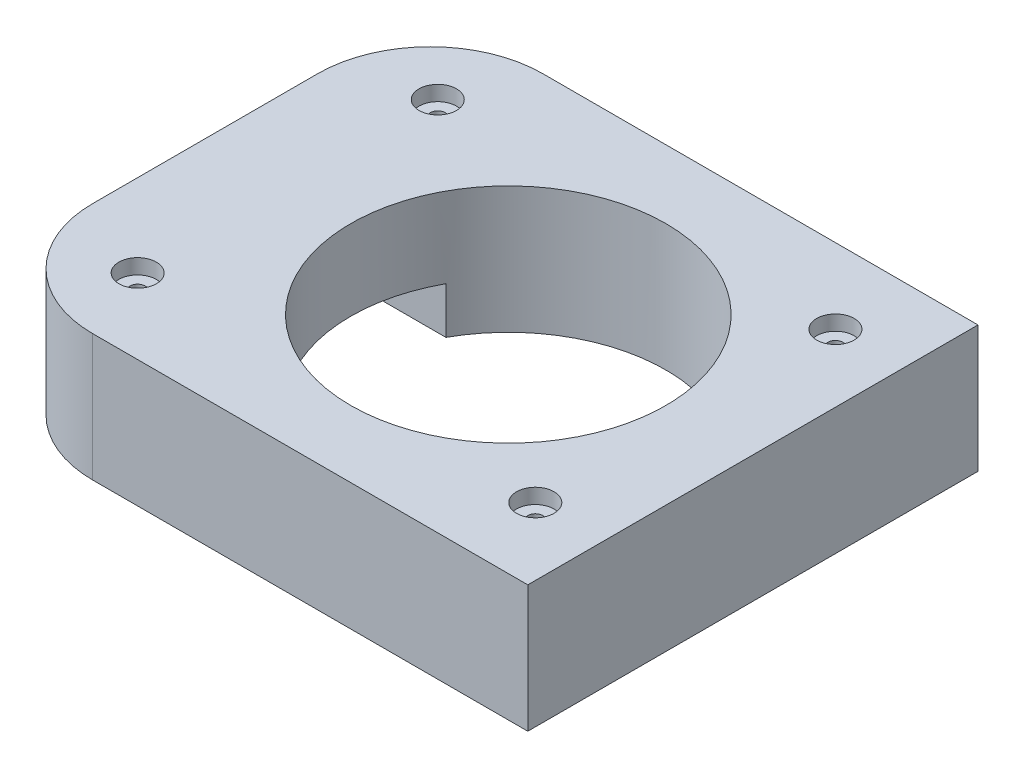
ISO-10303-21;
HEADER;
FILE_DESCRIPTION(('STEP AP214'),'2;1');
FILE_NAME('part.step','',(''),(''),'','','');
FILE_SCHEMA(('AUTOMOTIVE_DESIGN { 1 0 10303 214 1 1 1 1 }'));
ENDSEC;
DATA;
#1=APPLICATION_CONTEXT('core data for automotive mechanical design processes');
#2=APPLICATION_PROTOCOL_DEFINITION('international standard','automotive_design',2000,#1);
#3=PRODUCT_CONTEXT('',#1,'mechanical');
#4=PRODUCT('Part','Part','',(#3));
#5=PRODUCT_RELATED_PRODUCT_CATEGORY('part','',(#4));
#6=PRODUCT_DEFINITION_FORMATION('','',#4);
#7=PRODUCT_DEFINITION_CONTEXT('part definition',#1,'design');
#8=PRODUCT_DEFINITION('design','',#6,#7);
#9=PRODUCT_DEFINITION_SHAPE('','',#8);
#10=(LENGTH_UNIT() NAMED_UNIT(*) SI_UNIT(.MILLI.,.METRE.));
#11=(NAMED_UNIT(*) PLANE_ANGLE_UNIT() SI_UNIT($,.RADIAN.));
#12=(NAMED_UNIT(*) SI_UNIT($,.STERADIAN.) SOLID_ANGLE_UNIT());
#13=UNCERTAINTY_MEASURE_WITH_UNIT(LENGTH_MEASURE(1.E-05),#10,'distance_accuracy_value','');
#14=(GEOMETRIC_REPRESENTATION_CONTEXT(3) GLOBAL_UNCERTAINTY_ASSIGNED_CONTEXT((#13)) GLOBAL_UNIT_ASSIGNED_CONTEXT((#10,
#11,#12)) REPRESENTATION_CONTEXT('',''));
#15=CARTESIAN_POINT('',(0.,0.,0.));
#16=DIRECTION('',(0.,0.,1.));
#17=DIRECTION('',(1.,0.,0.));
#18=AXIS2_PLACEMENT_3D('',#15,#16,#17);
#19=CARTESIAN_POINT('',(34.,-0.001000000000001,-20.));
#20=DIRECTION('',(0.,1.,0.));
#21=DIRECTION('',(0.,0.,1.));
#22=AXIS2_PLACEMENT_3D('',#19,#20,#21);
#23=CYLINDRICAL_SURFACE('',#22,0.999999999999998);
#24=CARTESIAN_POINT('',(34.,0.,-20.));
#25=DIRECTION('',(0.,-1.,0.));
#26=DIRECTION('',(0.,0.,-1.));
#27=AXIS2_PLACEMENT_3D('',#24,#25,#26);
#28=CIRCLE('',#27,0.999999999999998);
#29=CARTESIAN_POINT('',(34.,0.,-21.));
#30=VERTEX_POINT('',#29);
#31=EDGE_CURVE('E213',#30,#30,#28,.F.);
#32=ORIENTED_EDGE('',*,*,#31,.F.);
#33=EDGE_LOOP('',(#32));
#34=FACE_BOUND('',#33,.T.);
#35=CARTESIAN_POINT('',(34.,14.9,-20.));
#36=DIRECTION('',(0.,1.,0.));
#37=DIRECTION('',(0.,0.,1.));
#38=AXIS2_PLACEMENT_3D('',#35,#36,#37);
#39=CIRCLE('',#38,0.999999999999998);
#40=CARTESIAN_POINT('',(34.,14.9,-19.));
#41=VERTEX_POINT('',#40);
#42=EDGE_CURVE('E37',#41,#41,#39,.F.);
#43=ORIENTED_EDGE('',*,*,#42,.F.);
#44=EDGE_LOOP('',(#43));
#45=FACE_BOUND('',#44,.T.);
#46=ADVANCED_FACE('F33',(#34,#45),#23,.F.);
#47=CARTESIAN_POINT('',(34.,-0.001000000000001,20.));
#48=DIRECTION('',(0.,1.,0.));
#49=DIRECTION('',(0.,0.,1.));
#50=AXIS2_PLACEMENT_3D('',#47,#48,#49);
#51=CYLINDRICAL_SURFACE('',#50,0.999999999999998);
#52=CARTESIAN_POINT('',(34.,0.,20.));
#53=DIRECTION('',(0.,-1.,0.));
#54=DIRECTION('',(0.,0.,-1.));
#55=AXIS2_PLACEMENT_3D('',#52,#53,#54);
#56=CIRCLE('',#55,0.999999999999998);
#57=CARTESIAN_POINT('',(34.,0.,19.));
#58=VERTEX_POINT('',#57);
#59=EDGE_CURVE('E209',#58,#58,#56,.F.);
#60=ORIENTED_EDGE('',*,*,#59,.F.);
#61=EDGE_LOOP('',(#60));
#62=FACE_BOUND('',#61,.T.);
#63=CARTESIAN_POINT('',(34.,14.9,20.));
#64=DIRECTION('',(0.,1.,0.));
#65=DIRECTION('',(0.,0.,1.));
#66=AXIS2_PLACEMENT_3D('',#63,#64,#65);
#67=CIRCLE('',#66,0.999999999999998);
#68=CARTESIAN_POINT('',(34.,14.9,21.));
#69=VERTEX_POINT('',#68);
#70=EDGE_CURVE('E195',#69,#69,#67,.F.);
#71=ORIENTED_EDGE('',*,*,#70,.F.);
#72=EDGE_LOOP('',(#71));
#73=FACE_BOUND('',#72,.T.);
#74=ADVANCED_FACE('F260',(#62,#73),#51,.F.);
#75=CARTESIAN_POINT('',(-19.,-0.001000000000001,20.));
#76=DIRECTION('',(0.,1.,0.));
#77=DIRECTION('',(0.,0.,1.));
#78=AXIS2_PLACEMENT_3D('',#75,#76,#77);
#79=CYLINDRICAL_SURFACE('',#78,1.);
#80=CARTESIAN_POINT('',(-19.,0.,20.));
#81=DIRECTION('',(0.,-1.,0.));
#82=DIRECTION('',(0.,0.,-1.));
#83=AXIS2_PLACEMENT_3D('',#80,#81,#82);
#84=CIRCLE('',#83,1.);
#85=CARTESIAN_POINT('',(-19.,0.,19.));
#86=VERTEX_POINT('',#85);
#87=EDGE_CURVE('E204',#86,#86,#84,.F.);
#88=ORIENTED_EDGE('',*,*,#87,.F.);
#89=EDGE_LOOP('',(#88));
#90=FACE_BOUND('',#89,.T.);
#91=CARTESIAN_POINT('',(-19.,14.9,20.));
#92=DIRECTION('',(0.,1.,0.));
#93=DIRECTION('',(0.,0.,1.));
#94=AXIS2_PLACEMENT_3D('',#91,#92,#93);
#95=CIRCLE('',#94,1.);
#96=CARTESIAN_POINT('',(-19.,14.9,21.));
#97=VERTEX_POINT('',#96);
#98=EDGE_CURVE('E192',#97,#97,#95,.F.);
#99=ORIENTED_EDGE('',*,*,#98,.F.);
#100=EDGE_LOOP('',(#99));
#101=FACE_BOUND('',#100,.T.);
#102=ADVANCED_FACE('F266',(#90,#101),#79,.F.);
#103=CARTESIAN_POINT('',(-19.,-0.001000000000001,-20.));
#104=DIRECTION('',(0.,1.,0.));
#105=DIRECTION('',(0.,0.,1.));
#106=AXIS2_PLACEMENT_3D('',#103,#104,#105);
#107=CYLINDRICAL_SURFACE('',#106,1.);
#108=CARTESIAN_POINT('',(-19.,0.,-20.));
#109=DIRECTION('',(0.,-1.,0.));
#110=DIRECTION('',(0.,0.,-1.));
#111=AXIS2_PLACEMENT_3D('',#108,#109,#110);
#112=CIRCLE('',#111,1.);
#113=CARTESIAN_POINT('',(-19.,0.,-21.));
#114=VERTEX_POINT('',#113);
#115=EDGE_CURVE('E200',#114,#114,#112,.F.);
#116=ORIENTED_EDGE('',*,*,#115,.F.);
#117=EDGE_LOOP('',(#116));
#118=FACE_BOUND('',#117,.T.);
#119=CARTESIAN_POINT('',(-19.,14.9,-20.));
#120=DIRECTION('',(0.,1.,0.));
#121=DIRECTION('',(0.,0.,1.));
#122=AXIS2_PLACEMENT_3D('',#119,#120,#121);
#123=CIRCLE('',#122,1.);
#124=CARTESIAN_POINT('',(-19.,14.9,-19.));
#125=VERTEX_POINT('',#124);
#126=EDGE_CURVE('E189',#125,#125,#123,.F.);
#127=ORIENTED_EDGE('',*,*,#126,.F.);
#128=EDGE_LOOP('',(#127));
#129=FACE_BOUND('',#128,.T.);
#130=ADVANCED_FACE('F273',(#118,#129),#107,.F.);
#131=CARTESIAN_POINT('',(-30.,16.9,-30.));
#132=DIRECTION('',(1.,0.,0.));
#133=DIRECTION('',(0.,0.,-1.));
#134=AXIS2_PLACEMENT_3D('',#131,#132,#133);
#135=PLANE('',#134);
#136=DIRECTION('',(0.,0.,-1.));
#137=VECTOR('',#136,1.);
#138=CARTESIAN_POINT('',(-29.9999999999997,6.2,-9.99999999999788));
#139=LINE('',#138,#137);
#140=CARTESIAN_POINT('',(-30.,6.2,9.99999999999834));
#141=VERTEX_POINT('',#140);
#142=CARTESIAN_POINT('',(-29.9999999999997,6.2,-9.99999999999788));
#143=VERTEX_POINT('',#142);
#144=EDGE_CURVE('E118',#141,#143,#139,.T.);
#145=ORIENTED_EDGE('',*,*,#144,.F.);
#146=DIRECTION('',(0.,-1.,0.));
#147=VECTOR('',#146,1.);
#148=CARTESIAN_POINT('',(-30.,6.2,9.99999999999834));
#149=LINE('',#148,#147);
#150=CARTESIAN_POINT('',(-30.,0.,9.99999999999834));
#151=VERTEX_POINT('',#150);
#152=EDGE_CURVE('E133',#141,#151,#149,.T.);
#153=ORIENTED_EDGE('',*,*,#152,.T.);
#154=DIRECTION('',(0.,0.,1.));
#155=VECTOR('',#154,1.);
#156=CARTESIAN_POINT('',(-30.,0.,-30.));
#157=LINE('',#156,#155);
#158=CARTESIAN_POINT('',(-30.,0.,15.));
#159=VERTEX_POINT('',#158);
#160=EDGE_CURVE('E143',#151,#159,#157,.T.);
#161=ORIENTED_EDGE('',*,*,#160,.T.);
#162=DIRECTION('',(0.,-1.,0.));
#163=VECTOR('',#162,1.);
#164=CARTESIAN_POINT('',(-30.,16.9,15.));
#165=LINE('',#164,#163);
#166=CARTESIAN_POINT('',(-30.,16.9,15.));
#167=VERTEX_POINT('',#166);
#168=EDGE_CURVE('E169',#159,#167,#165,.F.);
#169=ORIENTED_EDGE('',*,*,#168,.T.);
#170=DIRECTION('',(0.,0.,1.));
#171=VECTOR('',#170,1.);
#172=CARTESIAN_POINT('',(-30.,16.9,-30.));
#173=LINE('',#172,#171);
#174=CARTESIAN_POINT('',(-30.,16.9,-15.));
#175=VERTEX_POINT('',#174);
#176=EDGE_CURVE('E146',#175,#167,#173,.T.);
#177=ORIENTED_EDGE('',*,*,#176,.F.);
#178=DIRECTION('',(0.,-1.,0.));
#179=VECTOR('',#178,1.);
#180=CARTESIAN_POINT('',(-30.,16.9,-15.));
#181=LINE('',#180,#179);
#182=CARTESIAN_POINT('',(-30.,0.,-15.));
#183=VERTEX_POINT('',#182);
#184=EDGE_CURVE('E171',#175,#183,#181,.T.);
#185=ORIENTED_EDGE('',*,*,#184,.T.);
#186=CARTESIAN_POINT('',(-29.9999999999997,0.,-9.99999999999788));
#187=VERTEX_POINT('',#186);
#188=EDGE_CURVE('E132',#183,#187,#157,.T.);
#189=ORIENTED_EDGE('',*,*,#188,.T.);
#190=DIRECTION('',(0.,-1.,0.));
#191=VECTOR('',#190,1.);
#192=CARTESIAN_POINT('',(-29.9999999999997,6.2,-9.99999999999788));
#193=LINE('',#192,#191);
#194=EDGE_CURVE('E113',#143,#187,#193,.T.);
#195=ORIENTED_EDGE('',*,*,#194,.F.);
#196=EDGE_LOOP('',(#145,#153,#161,#169,#177,#185,#189,#195));
#197=FACE_BOUND('',#196,.T.);
#198=ADVANCED_FACE('F129',(#197),#135,.F.);
#199=CARTESIAN_POINT('',(43.,16.9,30.));
#200=DIRECTION('',(0.,0.,-1.));
#201=DIRECTION('',(-1.,0.,0.));
#202=AXIS2_PLACEMENT_3D('',#199,#200,#201);
#203=PLANE('',#202);
#204=DIRECTION('',(1.,0.,0.));
#205=VECTOR('',#204,1.);
#206=CARTESIAN_POINT('',(43.,16.9,30.));
#207=LINE('',#206,#205);
#208=CARTESIAN_POINT('',(-15.,16.9,30.));
#209=VERTEX_POINT('',#208);
#210=CARTESIAN_POINT('',(43.,16.9,30.));
#211=VERTEX_POINT('',#210);
#212=EDGE_CURVE('E148',#209,#211,#207,.T.);
#213=ORIENTED_EDGE('',*,*,#212,.F.);
#214=DIRECTION('',(0.,-1.,0.));
#215=VECTOR('',#214,1.);
#216=CARTESIAN_POINT('',(-15.,16.9,30.));
#217=LINE('',#216,#215);
#218=CARTESIAN_POINT('',(-15.,0.,30.));
#219=VERTEX_POINT('',#218);
#220=EDGE_CURVE('E183',#209,#219,#217,.T.);
#221=ORIENTED_EDGE('',*,*,#220,.T.);
#222=DIRECTION('',(1.,0.,0.));
#223=VECTOR('',#222,1.);
#224=CARTESIAN_POINT('',(43.,0.,30.));
#225=LINE('',#224,#223);
#226=CARTESIAN_POINT('',(43.,0.,30.));
#227=VERTEX_POINT('',#226);
#228=EDGE_CURVE('E158',#219,#227,#225,.T.);
#229=ORIENTED_EDGE('',*,*,#228,.T.);
#230=DIRECTION('',(0.,-1.,0.));
#231=VECTOR('',#230,1.);
#232=CARTESIAN_POINT('',(43.,16.9,30.));
#233=LINE('',#232,#231);
#234=EDGE_CURVE('E166',#211,#227,#233,.T.);
#235=ORIENTED_EDGE('',*,*,#234,.F.);
#236=EDGE_LOOP('',(#213,#221,#229,#235));
#237=FACE_BOUND('',#236,.T.);
#238=ADVANCED_FACE('F440',(#237),#203,.F.);
#239=CARTESIAN_POINT('',(43.,16.9,-30.));
#240=DIRECTION('',(-1.,0.,0.));
#241=DIRECTION('',(0.,0.,1.));
#242=AXIS2_PLACEMENT_3D('',#239,#240,#241);
#243=PLANE('',#242);
#244=DIRECTION('',(0.,0.,-1.));
#245=VECTOR('',#244,1.);
#246=CARTESIAN_POINT('',(43.,0.,-30.));
#247=LINE('',#246,#245);
#248=CARTESIAN_POINT('',(43.,0.,-30.));
#249=VERTEX_POINT('',#248);
#250=EDGE_CURVE('E160',#227,#249,#247,.T.);
#251=ORIENTED_EDGE('',*,*,#250,.T.);
#252=DIRECTION('',(0.,-1.,0.));
#253=VECTOR('',#252,1.);
#254=CARTESIAN_POINT('',(43.,16.9,-30.));
#255=LINE('',#254,#253);
#256=CARTESIAN_POINT('',(43.,16.9,-30.));
#257=VERTEX_POINT('',#256);
#258=EDGE_CURVE('E156',#257,#249,#255,.T.);
#259=ORIENTED_EDGE('',*,*,#258,.F.);
#260=DIRECTION('',(0.,0.,-1.));
#261=VECTOR('',#260,1.);
#262=CARTESIAN_POINT('',(43.,16.9,-30.));
#263=LINE('',#262,#261);
#264=EDGE_CURVE('E151',#211,#257,#263,.T.);
#265=ORIENTED_EDGE('',*,*,#264,.F.);
#266=ORIENTED_EDGE('',*,*,#234,.T.);
#267=EDGE_LOOP('',(#251,#259,#265,#266));
#268=FACE_BOUND('',#267,.T.);
#269=ADVANCED_FACE('F254',(#268),#243,.F.);
#270=CARTESIAN_POINT('',(43.,16.9,-30.));
#271=DIRECTION('',(0.,0.,1.));
#272=DIRECTION('',(1.,0.,0.));
#273=AXIS2_PLACEMENT_3D('',#270,#271,#272);
#274=PLANE('',#273);
#275=DIRECTION('',(-1.,0.,0.));
#276=VECTOR('',#275,1.);
#277=CARTESIAN_POINT('',(43.,0.,-30.));
#278=LINE('',#277,#276);
#279=CARTESIAN_POINT('',(-15.,0.,-30.));
#280=VERTEX_POINT('',#279);
#281=EDGE_CURVE('E149',#249,#280,#278,.T.);
#282=ORIENTED_EDGE('',*,*,#281,.T.);
#283=DIRECTION('',(0.,-1.,0.));
#284=VECTOR('',#283,1.);
#285=CARTESIAN_POINT('',(-15.,16.9,-30.));
#286=LINE('',#285,#284);
#287=CARTESIAN_POINT('',(-15.,16.9,-30.));
#288=VERTEX_POINT('',#287);
#289=EDGE_CURVE('E178',#280,#288,#286,.F.);
#290=ORIENTED_EDGE('',*,*,#289,.T.);
#291=DIRECTION('',(-1.,0.,0.));
#292=VECTOR('',#291,1.);
#293=CARTESIAN_POINT('',(43.,16.9,-30.));
#294=LINE('',#293,#292);
#295=EDGE_CURVE('E153',#257,#288,#294,.T.);
#296=ORIENTED_EDGE('',*,*,#295,.F.);
#297=ORIENTED_EDGE('',*,*,#258,.T.);
#298=EDGE_LOOP('',(#282,#290,#296,#297));
#299=FACE_BOUND('',#298,.T.);
#300=ADVANCED_FACE('F246',(#299),#274,.F.);
#301=CARTESIAN_POINT('',(0.,16.9,0.));
#302=DIRECTION('',(0.,-1.,0.));
#303=DIRECTION('',(0.,0.,-1.));
#304=AXIS2_PLACEMENT_3D('',#301,#302,#303);
#305=PLANE('',#304);
#306=CARTESIAN_POINT('',(34.,16.9,-20.));
#307=DIRECTION('',(0.,1.,0.));
#308=DIRECTION('',(0.,0.,1.));
#309=AXIS2_PLACEMENT_3D('',#306,#307,#308);
#310=CIRCLE('',#309,2.5);
#311=CARTESIAN_POINT('',(34.,16.9,-17.5));
#312=VERTEX_POINT('',#311);
#313=EDGE_CURVE('E489',#312,#312,#310,.T.);
#314=ORIENTED_EDGE('',*,*,#313,.F.);
#315=EDGE_LOOP('',(#314));
#316=FACE_BOUND('',#315,.T.);
#317=CARTESIAN_POINT('',(34.,16.9,20.));
#318=DIRECTION('',(0.,1.,0.));
#319=DIRECTION('',(0.,0.,1.));
#320=AXIS2_PLACEMENT_3D('',#317,#318,#319);
#321=CIRCLE('',#320,2.5);
#322=CARTESIAN_POINT('',(34.,16.9,22.5));
#323=VERTEX_POINT('',#322);
#324=EDGE_CURVE('E495',#323,#323,#321,.T.);
#325=ORIENTED_EDGE('',*,*,#324,.F.);
#326=EDGE_LOOP('',(#325));
#327=FACE_BOUND('',#326,.T.);
#328=CARTESIAN_POINT('',(-19.,16.9,20.));
#329=DIRECTION('',(0.,1.,0.));
#330=DIRECTION('',(0.,0.,1.));
#331=AXIS2_PLACEMENT_3D('',#328,#329,#330);
#332=CIRCLE('',#331,2.5);
#333=CARTESIAN_POINT('',(-19.,16.9,22.5));
#334=VERTEX_POINT('',#333);
#335=EDGE_CURVE('E501',#334,#334,#332,.T.);
#336=ORIENTED_EDGE('',*,*,#335,.F.);
#337=EDGE_LOOP('',(#336));
#338=FACE_BOUND('',#337,.T.);
#339=CARTESIAN_POINT('',(-19.,16.9,-20.));
#340=DIRECTION('',(0.,1.,0.));
#341=DIRECTION('',(0.,0.,1.));
#342=AXIS2_PLACEMENT_3D('',#339,#340,#341);
#343=CIRCLE('',#342,2.5);
#344=CARTESIAN_POINT('',(-19.,16.9,-17.5));
#345=VERTEX_POINT('',#344);
#346=EDGE_CURVE('E483',#345,#345,#343,.T.);
#347=ORIENTED_EDGE('',*,*,#346,.F.);
#348=EDGE_LOOP('',(#347));
#349=FACE_BOUND('',#348,.T.);
#350=CARTESIAN_POINT('',(10.4999999999993,16.9,0.100000000001667));
#351=DIRECTION('',(0.,1.,0.));
#352=DIRECTION('',(0.,0.,1.));
#353=AXIS2_PLACEMENT_3D('',#350,#351,#352);
#354=CIRCLE('',#353,21.0000000000009);
#355=CARTESIAN_POINT('',(10.4999999999993,16.9,21.1000000000026));
#356=VERTEX_POINT('',#355);
#357=EDGE_CURVE('E140',#356,#356,#354,.T.);
#358=ORIENTED_EDGE('',*,*,#357,.F.);
#359=EDGE_LOOP('',(#358));
#360=FACE_BOUND('',#359,.T.);
#361=ORIENTED_EDGE('',*,*,#295,.T.);
#362=CARTESIAN_POINT('',(-15.,16.9,-15.));
#363=DIRECTION('',(0.,-1.,0.));
#364=DIRECTION('',(0.,0.,-1.));
#365=AXIS2_PLACEMENT_3D('',#362,#363,#364);
#366=CIRCLE('',#365,15.);
#367=EDGE_CURVE('E181',#288,#175,#366,.F.);
#368=ORIENTED_EDGE('',*,*,#367,.T.);
#369=ORIENTED_EDGE('',*,*,#176,.T.);
#370=CARTESIAN_POINT('',(-15.,16.9,15.));
#371=DIRECTION('',(0.,-1.,0.));
#372=DIRECTION('',(0.,0.,-1.));
#373=AXIS2_PLACEMENT_3D('',#370,#371,#372);
#374=CIRCLE('',#373,15.);
#375=EDGE_CURVE('E58',#167,#209,#374,.F.);
#376=ORIENTED_EDGE('',*,*,#375,.T.);
#377=ORIENTED_EDGE('',*,*,#212,.T.);
#378=ORIENTED_EDGE('',*,*,#264,.T.);
#379=EDGE_LOOP('',(#361,#368,#369,#376,#377,#378));
#380=FACE_BOUND('',#379,.T.);
#381=ADVANCED_FACE('F231',(#316,#327,#338,#349,#360,#380),#305,.F.);
#382=CARTESIAN_POINT('',(0.,0.,0.));
#383=DIRECTION('',(0.,-1.,0.));
#384=DIRECTION('',(0.,0.,-1.));
#385=AXIS2_PLACEMENT_3D('',#382,#383,#384);
#386=PLANE('',#385);
#387=ORIENTED_EDGE('',*,*,#115,.T.);
#388=EDGE_LOOP('',(#387));
#389=FACE_BOUND('',#388,.T.);
#390=ORIENTED_EDGE('',*,*,#87,.T.);
#391=EDGE_LOOP('',(#390));
#392=FACE_BOUND('',#391,.T.);
#393=ORIENTED_EDGE('',*,*,#59,.T.);
#394=EDGE_LOOP('',(#393));
#395=FACE_BOUND('',#394,.T.);
#396=ORIENTED_EDGE('',*,*,#31,.T.);
#397=EDGE_LOOP('',(#396));
#398=FACE_BOUND('',#397,.T.);
#399=DIRECTION('',(-1.,0.,0.));
#400=VECTOR('',#399,1.);
#401=CARTESIAN_POINT('',(-30.,0.,9.99999999999834));
#402=LINE('',#401,#400);
#403=CARTESIAN_POINT('',(-8.01998920086429,0.,9.99999999999834));
#404=VERTEX_POINT('',#403);
#405=EDGE_CURVE('E126',#404,#151,#402,.T.);
#406=ORIENTED_EDGE('',*,*,#405,.F.);
#407=CARTESIAN_POINT('',(10.4999999999993,0.,0.100000000001667));
#408=DIRECTION('',(0.,-1.,0.));
#409=DIRECTION('',(0.,0.,-1.));
#410=AXIS2_PLACEMENT_3D('',#407,#408,#409);
#411=CIRCLE('',#410,21.0000000000009);
#412=CARTESIAN_POINT('',(-7.91168107479795,0.,-9.99999999999788));
#413=VERTEX_POINT('',#412);
#414=EDGE_CURVE('E135',#404,#413,#411,.F.);
#415=ORIENTED_EDGE('',*,*,#414,.T.);
#416=DIRECTION('',(1.,0.,0.));
#417=VECTOR('',#416,1.);
#418=CARTESIAN_POINT('',(-29.9999999999997,0.,-9.99999999999788));
#419=LINE('',#418,#417);
#420=EDGE_CURVE('E215',#187,#413,#419,.T.);
#421=ORIENTED_EDGE('',*,*,#420,.F.);
#422=ORIENTED_EDGE('',*,*,#188,.F.);
#423=CARTESIAN_POINT('',(-15.,0.,-15.));
#424=DIRECTION('',(0.,-1.,0.));
#425=DIRECTION('',(0.,0.,-1.));
#426=AXIS2_PLACEMENT_3D('',#423,#424,#425);
#427=CIRCLE('',#426,15.);
#428=EDGE_CURVE('E176',#183,#280,#427,.T.);
#429=ORIENTED_EDGE('',*,*,#428,.T.);
#430=ORIENTED_EDGE('',*,*,#281,.F.);
#431=ORIENTED_EDGE('',*,*,#250,.F.);
#432=ORIENTED_EDGE('',*,*,#228,.F.);
#433=CARTESIAN_POINT('',(-15.,0.,15.));
#434=DIRECTION('',(0.,-1.,0.));
#435=DIRECTION('',(0.,0.,-1.));
#436=AXIS2_PLACEMENT_3D('',#433,#434,#435);
#437=CIRCLE('',#436,15.);
#438=EDGE_CURVE('E173',#219,#159,#437,.T.);
#439=ORIENTED_EDGE('',*,*,#438,.T.);
#440=ORIENTED_EDGE('',*,*,#160,.F.);
#441=EDGE_LOOP('',(#406,#415,#421,#422,#429,#430,#431,#432,#439,#440));
#442=FACE_BOUND('',#441,.T.);
#443=ADVANCED_FACE('F223',(#389,#392,#395,#398,#442),#386,.T.);
#444=CARTESIAN_POINT('',(-15.,16.9,-15.));
#445=DIRECTION('',(0.,-1.,0.));
#446=DIRECTION('',(0.,0.,-1.));
#447=AXIS2_PLACEMENT_3D('',#444,#445,#446);
#448=CYLINDRICAL_SURFACE('',#447,15.);
#449=ORIENTED_EDGE('',*,*,#367,.F.);
#450=ORIENTED_EDGE('',*,*,#289,.F.);
#451=ORIENTED_EDGE('',*,*,#428,.F.);
#452=ORIENTED_EDGE('',*,*,#184,.F.);
#453=EDGE_LOOP('',(#449,#450,#451,#452));
#454=FACE_BOUND('',#453,.T.);
#455=ADVANCED_FACE('F236',(#454),#448,.T.);
#456=CARTESIAN_POINT('',(-15.,16.9,15.));
#457=DIRECTION('',(0.,-1.,0.));
#458=DIRECTION('',(0.,0.,-1.));
#459=AXIS2_PLACEMENT_3D('',#456,#457,#458);
#460=CYLINDRICAL_SURFACE('',#459,15.);
#461=ORIENTED_EDGE('',*,*,#375,.F.);
#462=ORIENTED_EDGE('',*,*,#168,.F.);
#463=ORIENTED_EDGE('',*,*,#438,.F.);
#464=ORIENTED_EDGE('',*,*,#220,.F.);
#465=EDGE_LOOP('',(#461,#462,#463,#464));
#466=FACE_BOUND('',#465,.T.);
#467=ADVANCED_FACE('F35',(#466),#460,.T.);
#468=CARTESIAN_POINT('',(10.4999999999993,-0.001000000000001,0.100000000001667));
#469=DIRECTION('',(0.,1.,0.));
#470=DIRECTION('',(0.,0.,1.));
#471=AXIS2_PLACEMENT_3D('',#468,#469,#470);
#472=CYLINDRICAL_SURFACE('',#471,21.0000000000009);
#473=ORIENTED_EDGE('',*,*,#414,.F.);
#474=DIRECTION('',(0.,1.,0.));
#475=VECTOR('',#474,1.);
#476=CARTESIAN_POINT('',(-8.01998920086428,-0.001000000000001,9.99999999999834));
#477=LINE('',#476,#475);
#478=CARTESIAN_POINT('',(-8.01998920086429,6.2,9.99999999999834));
#479=VERTEX_POINT('',#478);
#480=EDGE_CURVE('E11',#404,#479,#477,.T.);
#481=ORIENTED_EDGE('',*,*,#480,.T.);
#482=CARTESIAN_POINT('',(10.4999999999993,6.2,0.100000000001667));
#483=DIRECTION('',(0.,1.,0.));
#484=DIRECTION('',(0.,0.,1.));
#485=AXIS2_PLACEMENT_3D('',#482,#483,#484);
#486=CIRCLE('',#485,21.0000000000009);
#487=CARTESIAN_POINT('',(-7.91168107479795,6.2,-9.99999999999788));
#488=VERTEX_POINT('',#487);
#489=EDGE_CURVE('E186',#479,#488,#486,.F.);
#490=ORIENTED_EDGE('',*,*,#489,.T.);
#491=DIRECTION('',(0.,1.,0.));
#492=VECTOR('',#491,1.);
#493=CARTESIAN_POINT('',(-7.91168107479795,-0.001000000000001,-9.99999999999787));
#494=LINE('',#493,#492);
#495=EDGE_CURVE('E42',#488,#413,#494,.F.);
#496=ORIENTED_EDGE('',*,*,#495,.T.);
#497=EDGE_LOOP('',(#473,#481,#490,#496));
#498=FACE_BOUND('',#497,.T.);
#499=ORIENTED_EDGE('',*,*,#357,.T.);
#500=EDGE_LOOP('',(#499));
#501=FACE_BOUND('',#500,.T.);
#502=ADVANCED_FACE('F239',(#498,#501),#472,.F.);
#503=CARTESIAN_POINT('',(-30.,6.2,9.99999999999834));
#504=DIRECTION('',(0.,0.,1.));
#505=DIRECTION('',(1.,0.,0.));
#506=AXIS2_PLACEMENT_3D('',#503,#504,#505);
#507=PLANE('',#506);
#508=ORIENTED_EDGE('',*,*,#405,.T.);
#509=ORIENTED_EDGE('',*,*,#152,.F.);
#510=DIRECTION('',(-1.,0.,0.));
#511=VECTOR('',#510,1.);
#512=CARTESIAN_POINT('',(-30.,6.2,9.99999999999834));
#513=LINE('',#512,#511);
#514=EDGE_CURVE('E117',#479,#141,#513,.T.);
#515=ORIENTED_EDGE('',*,*,#514,.F.);
#516=ORIENTED_EDGE('',*,*,#480,.F.);
#517=EDGE_LOOP('',(#508,#509,#515,#516));
#518=FACE_BOUND('',#517,.T.);
#519=ADVANCED_FACE('F219',(#518),#507,.F.);
#520=CARTESIAN_POINT('',(-29.9999999999997,6.2,-9.99999999999788));
#521=DIRECTION('',(0.,0.,-1.));
#522=DIRECTION('',(-1.,0.,0.));
#523=AXIS2_PLACEMENT_3D('',#520,#521,#522);
#524=PLANE('',#523);
#525=DIRECTION('',(1.,0.,0.));
#526=VECTOR('',#525,1.);
#527=CARTESIAN_POINT('',(-29.9999999999997,6.2,-9.99999999999788));
#528=LINE('',#527,#526);
#529=EDGE_CURVE('E50',#143,#488,#528,.T.);
#530=ORIENTED_EDGE('',*,*,#529,.F.);
#531=ORIENTED_EDGE('',*,*,#194,.T.);
#532=ORIENTED_EDGE('',*,*,#420,.T.);
#533=ORIENTED_EDGE('',*,*,#495,.F.);
#534=EDGE_LOOP('',(#530,#531,#532,#533));
#535=FACE_BOUND('',#534,.T.);
#536=ADVANCED_FACE('F111',(#535),#524,.F.);
#537=CARTESIAN_POINT('',(0.,6.2,0.));
#538=DIRECTION('',(0.,1.,0.));
#539=DIRECTION('',(0.,0.,1.));
#540=AXIS2_PLACEMENT_3D('',#537,#538,#539);
#541=PLANE('',#540);
#542=ORIENTED_EDGE('',*,*,#514,.T.);
#543=ORIENTED_EDGE('',*,*,#144,.T.);
#544=ORIENTED_EDGE('',*,*,#529,.T.);
#545=ORIENTED_EDGE('',*,*,#489,.F.);
#546=EDGE_LOOP('',(#542,#543,#544,#545));
#547=FACE_BOUND('',#546,.T.);
#548=ADVANCED_FACE('F121',(#547),#541,.F.);
#549=CARTESIAN_POINT('',(-19.,14.9,-20.));
#550=DIRECTION('',(0.,1.,0.));
#551=DIRECTION('',(0.,0.,1.));
#552=AXIS2_PLACEMENT_3D('',#549,#550,#551);
#553=PLANE('',#552);
#554=CARTESIAN_POINT('',(-19.,14.9,-20.));
#555=DIRECTION('',(0.,1.,0.));
#556=DIRECTION('',(0.,0.,1.));
#557=AXIS2_PLACEMENT_3D('',#554,#555,#556);
#558=CIRCLE('',#557,2.5);
#559=CARTESIAN_POINT('',(-19.,14.9,-17.5));
#560=VERTEX_POINT('',#559);
#561=EDGE_CURVE('E193',#560,#560,#558,.T.);
#562=ORIENTED_EDGE('',*,*,#561,.T.);
#563=EDGE_LOOP('',(#562));
#564=FACE_BOUND('',#563,.T.);
#565=ORIENTED_EDGE('',*,*,#126,.T.);
#566=EDGE_LOOP('',(#565));
#567=FACE_BOUND('',#566,.T.);
#568=ADVANCED_FACE('F277',(#564,#567),#553,.T.);
#569=CARTESIAN_POINT('',(-19.,14.9,-20.));
#570=DIRECTION('',(0.,1.,0.));
#571=DIRECTION('',(0.,0.,1.));
#572=AXIS2_PLACEMENT_3D('',#569,#570,#571);
#573=CYLINDRICAL_SURFACE('',#572,2.5);
#574=ORIENTED_EDGE('',*,*,#561,.F.);
#575=EDGE_LOOP('',(#574));
#576=FACE_BOUND('',#575,.T.);
#577=ORIENTED_EDGE('',*,*,#346,.T.);
#578=EDGE_LOOP('',(#577));
#579=FACE_BOUND('',#578,.T.);
#580=ADVANCED_FACE('F296',(#576,#579),#573,.F.);
#581=CARTESIAN_POINT('',(-19.,14.9,20.));
#582=DIRECTION('',(0.,1.,0.));
#583=DIRECTION('',(0.,0.,1.));
#584=AXIS2_PLACEMENT_3D('',#581,#582,#583);
#585=PLANE('',#584);
#586=CARTESIAN_POINT('',(-19.,14.9,20.));
#587=DIRECTION('',(0.,1.,0.));
#588=DIRECTION('',(0.,0.,1.));
#589=AXIS2_PLACEMENT_3D('',#586,#587,#588);
#590=CIRCLE('',#589,2.5);
#591=CARTESIAN_POINT('',(-19.,14.9,22.5));
#592=VERTEX_POINT('',#591);
#593=EDGE_CURVE('E486',#592,#592,#590,.T.);
#594=ORIENTED_EDGE('',*,*,#593,.T.);
#595=EDGE_LOOP('',(#594));
#596=FACE_BOUND('',#595,.T.);
#597=ORIENTED_EDGE('',*,*,#98,.T.);
#598=EDGE_LOOP('',(#597));
#599=FACE_BOUND('',#598,.T.);
#600=ADVANCED_FACE('F304',(#596,#599),#585,.T.);
#601=CARTESIAN_POINT('',(-19.,14.9,20.));
#602=DIRECTION('',(0.,1.,0.));
#603=DIRECTION('',(0.,0.,1.));
#604=AXIS2_PLACEMENT_3D('',#601,#602,#603);
#605=CYLINDRICAL_SURFACE('',#604,2.5);
#606=ORIENTED_EDGE('',*,*,#593,.F.);
#607=EDGE_LOOP('',(#606));
#608=FACE_BOUND('',#607,.T.);
#609=ORIENTED_EDGE('',*,*,#335,.T.);
#610=EDGE_LOOP('',(#609));
#611=FACE_BOUND('',#610,.T.);
#612=ADVANCED_FACE('F312',(#608,#611),#605,.F.);
#613=CARTESIAN_POINT('',(34.,14.9,20.));
#614=DIRECTION('',(0.,1.,0.));
#615=DIRECTION('',(0.,0.,1.));
#616=AXIS2_PLACEMENT_3D('',#613,#614,#615);
#617=PLANE('',#616);
#618=CARTESIAN_POINT('',(34.,14.9,20.));
#619=DIRECTION('',(0.,1.,0.));
#620=DIRECTION('',(0.,0.,1.));
#621=AXIS2_PLACEMENT_3D('',#618,#619,#620);
#622=CIRCLE('',#621,2.5);
#623=CARTESIAN_POINT('',(34.,14.9,22.5));
#624=VERTEX_POINT('',#623);
#625=EDGE_CURVE('E498',#624,#624,#622,.T.);
#626=ORIENTED_EDGE('',*,*,#625,.T.);
#627=EDGE_LOOP('',(#626));
#628=FACE_BOUND('',#627,.T.);
#629=ORIENTED_EDGE('',*,*,#70,.T.);
#630=EDGE_LOOP('',(#629));
#631=FACE_BOUND('',#630,.T.);
#632=ADVANCED_FACE('F320',(#628,#631),#617,.T.);
#633=CARTESIAN_POINT('',(34.,14.9,20.));
#634=DIRECTION('',(0.,1.,0.));
#635=DIRECTION('',(0.,0.,1.));
#636=AXIS2_PLACEMENT_3D('',#633,#634,#635);
#637=CYLINDRICAL_SURFACE('',#636,2.5);
#638=ORIENTED_EDGE('',*,*,#625,.F.);
#639=EDGE_LOOP('',(#638));
#640=FACE_BOUND('',#639,.T.);
#641=ORIENTED_EDGE('',*,*,#324,.T.);
#642=EDGE_LOOP('',(#641));
#643=FACE_BOUND('',#642,.T.);
#644=ADVANCED_FACE('F328',(#640,#643),#637,.F.);
#645=CARTESIAN_POINT('',(34.,14.9,-20.));
#646=DIRECTION('',(0.,1.,0.));
#647=DIRECTION('',(0.,0.,1.));
#648=AXIS2_PLACEMENT_3D('',#645,#646,#647);
#649=PLANE('',#648);
#650=CARTESIAN_POINT('',(34.,14.9,-20.));
#651=DIRECTION('',(0.,1.,0.));
#652=DIRECTION('',(0.,0.,1.));
#653=AXIS2_PLACEMENT_3D('',#650,#651,#652);
#654=CIRCLE('',#653,2.5);
#655=CARTESIAN_POINT('',(34.,14.9,-17.5));
#656=VERTEX_POINT('',#655);
#657=EDGE_CURVE('E492',#656,#656,#654,.T.);
#658=ORIENTED_EDGE('',*,*,#657,.T.);
#659=EDGE_LOOP('',(#658));
#660=FACE_BOUND('',#659,.T.);
#661=ORIENTED_EDGE('',*,*,#42,.T.);
#662=EDGE_LOOP('',(#661));
#663=FACE_BOUND('',#662,.T.);
#664=ADVANCED_FACE('F336',(#660,#663),#649,.T.);
#665=CARTESIAN_POINT('',(34.,14.9,-20.));
#666=DIRECTION('',(0.,1.,0.));
#667=DIRECTION('',(0.,0.,1.));
#668=AXIS2_PLACEMENT_3D('',#665,#666,#667);
#669=CYLINDRICAL_SURFACE('',#668,2.5);
#670=ORIENTED_EDGE('',*,*,#657,.F.);
#671=EDGE_LOOP('',(#670));
#672=FACE_BOUND('',#671,.T.);
#673=ORIENTED_EDGE('',*,*,#313,.T.);
#674=EDGE_LOOP('',(#673));
#675=FACE_BOUND('',#674,.T.);
#676=ADVANCED_FACE('F344',(#672,#675),#669,.F.);
#677=CLOSED_SHELL('',(#46,#74,#102,#130,#198,#238,#269,#300,#381,#443,#455,#467,#502,#519,#536,
#548,#568,#580,#600,#612,#632,#644,#664,#676));
#678=MANIFOLD_SOLID_BREP('B2',#677);
#679=ADVANCED_BREP_SHAPE_REPRESENTATION('',(#18,#678),#14);
#680=SHAPE_DEFINITION_REPRESENTATION(#9,#679);
ENDSEC;
END-ISO-10303-21;
